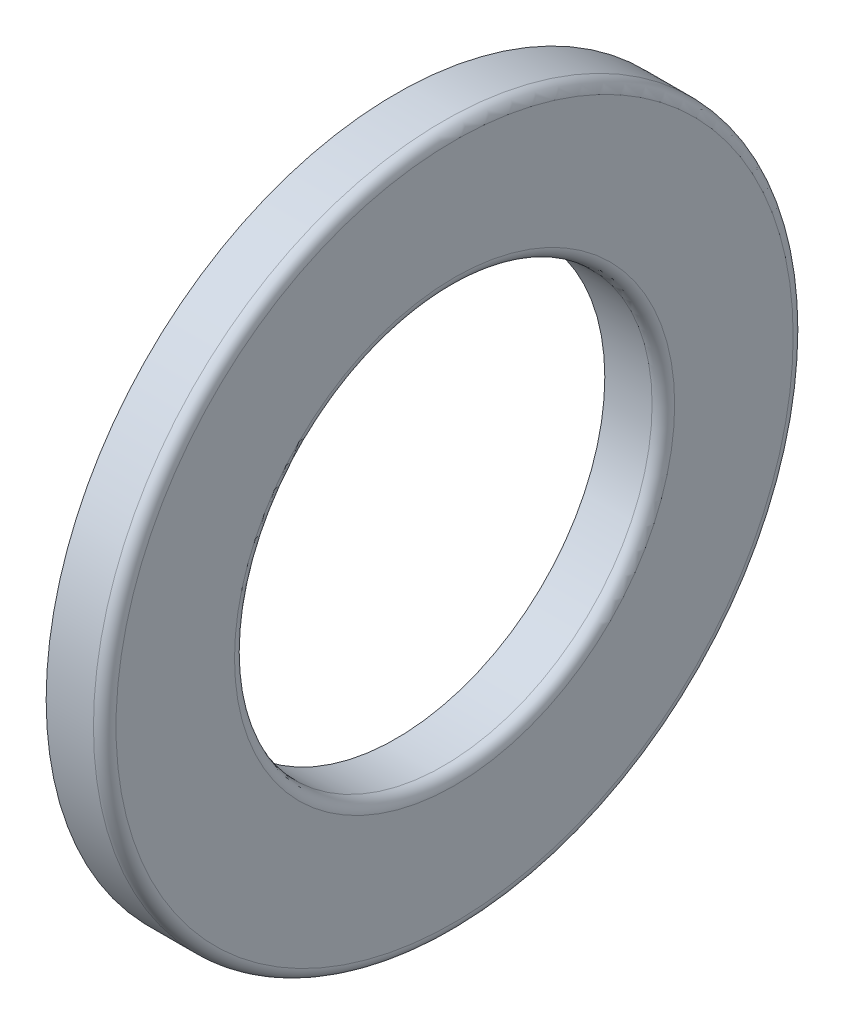
ISO-10303-21;
HEADER;
FILE_DESCRIPTION(('STEP AP214'),'2;1');
FILE_NAME('part.step','',(''),(''),'','','');
FILE_SCHEMA(('AUTOMOTIVE_DESIGN { 1 0 10303 214 1 1 1 1 }'));
ENDSEC;
DATA;
#1=APPLICATION_CONTEXT('core data for automotive mechanical design processes');
#2=APPLICATION_PROTOCOL_DEFINITION('international standard','automotive_design',2000,#1);
#3=PRODUCT_CONTEXT('',#1,'mechanical');
#4=PRODUCT('Part','Part','',(#3));
#5=PRODUCT_RELATED_PRODUCT_CATEGORY('part','',(#4));
#6=PRODUCT_DEFINITION_FORMATION('','',#4);
#7=PRODUCT_DEFINITION_CONTEXT('part definition',#1,'design');
#8=PRODUCT_DEFINITION('design','',#6,#7);
#9=PRODUCT_DEFINITION_SHAPE('','',#8);
#10=(LENGTH_UNIT() NAMED_UNIT(*) SI_UNIT(.MILLI.,.METRE.));
#11=(NAMED_UNIT(*) PLANE_ANGLE_UNIT() SI_UNIT($,.RADIAN.));
#12=(NAMED_UNIT(*) SI_UNIT($,.STERADIAN.) SOLID_ANGLE_UNIT());
#13=UNCERTAINTY_MEASURE_WITH_UNIT(LENGTH_MEASURE(1.E-05),#10,'distance_accuracy_value','');
#14=(GEOMETRIC_REPRESENTATION_CONTEXT(3) GLOBAL_UNCERTAINTY_ASSIGNED_CONTEXT((#13)) GLOBAL_UNIT_ASSIGNED_CONTEXT((#10,
#11,#12)) REPRESENTATION_CONTEXT('',''));
#15=CARTESIAN_POINT('',(0.,0.,0.));
#16=DIRECTION('',(0.,0.,1.));
#17=DIRECTION('',(1.,0.,0.));
#18=AXIS2_PLACEMENT_3D('',#15,#16,#17);
#19=CARTESIAN_POINT('',(9.00000000000001,0.,0.));
#20=DIRECTION('',(1.,0.,0.));
#21=DIRECTION('',(0.,0.,-1.));
#22=AXIS2_PLACEMENT_3D('',#19,#20,#21);
#23=TOROIDAL_SURFACE('',#22,24.25,4.76249999999999);
#24=CARTESIAN_POINT('',(12.81,0.,0.));
#25=DIRECTION('',(1.,0.,0.));
#26=DIRECTION('',(0.,0.,-1.));
#27=AXIS2_PLACEMENT_3D('',#24,#25,#26);
#28=CIRCLE('',#27,21.3925);
#29=CARTESIAN_POINT('',(12.81,0.,-21.3925));
#30=VERTEX_POINT('',#29);
#31=EDGE_CURVE('E87',#30,#30,#28,.F.);
#32=ORIENTED_EDGE('',*,*,#31,.F.);
#33=EDGE_LOOP('',(#32));
#34=FACE_BOUND('',#33,.T.);
#35=CARTESIAN_POINT('',(12.81,0.,0.));
#36=DIRECTION('',(1.,0.,0.));
#37=DIRECTION('',(0.,0.,-1.));
#38=AXIS2_PLACEMENT_3D('',#35,#36,#37);
#39=CIRCLE('',#38,27.1075);
#40=CARTESIAN_POINT('',(12.81,0.,-27.1075));
#41=VERTEX_POINT('',#40);
#42=EDGE_CURVE('E18',#41,#41,#39,.T.);
#43=ORIENTED_EDGE('',*,*,#42,.F.);
#44=EDGE_LOOP('',(#43));
#45=FACE_BOUND('',#44,.T.);
#46=ADVANCED_FACE('F14',(#34,#45),#23,.F.);
#47=CARTESIAN_POINT('',(12.81,31.,0.));
#48=DIRECTION('',(-1.,0.,0.));
#49=DIRECTION('',(0.,0.,1.));
#50=AXIS2_PLACEMENT_3D('',#47,#48,#49);
#51=PLANE('',#50);
#52=CARTESIAN_POINT('',(12.81,0.,0.));
#53=DIRECTION('',(-1.,0.,0.));
#54=DIRECTION('',(0.,0.,1.));
#55=AXIS2_PLACEMENT_3D('',#52,#53,#54);
#56=CIRCLE('',#55,31.);
#57=CARTESIAN_POINT('',(12.81,0.,31.));
#58=VERTEX_POINT('',#57);
#59=EDGE_CURVE('E85',#58,#58,#56,.F.);
#60=ORIENTED_EDGE('',*,*,#59,.F.);
#61=EDGE_LOOP('',(#60));
#62=FACE_BOUND('',#61,.T.);
#63=ORIENTED_EDGE('',*,*,#42,.T.);
#64=EDGE_LOOP('',(#63));
#65=FACE_BOUND('',#64,.T.);
#66=ADVANCED_FACE('F94',(#62,#65),#51,.T.);
#67=CARTESIAN_POINT('',(12.81,21.3925,0.));
#68=DIRECTION('',(-1.,0.,0.));
#69=DIRECTION('',(0.,0.,1.));
#70=AXIS2_PLACEMENT_3D('',#67,#68,#69);
#71=PLANE('',#70);
#72=ORIENTED_EDGE('',*,*,#31,.T.);
#73=EDGE_LOOP('',(#72));
#74=FACE_BOUND('',#73,.T.);
#75=CARTESIAN_POINT('',(12.81,0.,0.));
#76=DIRECTION('',(-1.,0.,0.));
#77=DIRECTION('',(0.,0.,1.));
#78=AXIS2_PLACEMENT_3D('',#75,#76,#77);
#79=CIRCLE('',#78,18.5);
#80=CARTESIAN_POINT('',(12.81,0.,18.5));
#81=VERTEX_POINT('',#80);
#82=EDGE_CURVE('E37',#81,#81,#79,.F.);
#83=ORIENTED_EDGE('',*,*,#82,.T.);
#84=EDGE_LOOP('',(#83));
#85=FACE_BOUND('',#84,.T.);
#86=ADVANCED_FACE('F102',(#74,#85),#71,.T.);
#87=CARTESIAN_POINT('',(17.,0.,0.));
#88=DIRECTION('',(-1.,0.,0.));
#89=DIRECTION('',(0.,0.,1.));
#90=AXIS2_PLACEMENT_3D('',#87,#88,#89);
#91=CYLINDRICAL_SURFACE('',#90,31.);
#92=CARTESIAN_POINT('',(17.,0.,0.));
#93=DIRECTION('',(1.,0.,0.));
#94=DIRECTION('',(0.,0.,-1.));
#95=AXIS2_PLACEMENT_3D('',#92,#93,#94);
#96=CIRCLE('',#95,31.);
#97=CARTESIAN_POINT('',(17.,0.,-31.));
#98=VERTEX_POINT('',#97);
#99=EDGE_CURVE('E32',#98,#98,#96,.T.);
#100=ORIENTED_EDGE('',*,*,#99,.F.);
#101=EDGE_LOOP('',(#100));
#102=FACE_BOUND('',#101,.T.);
#103=ORIENTED_EDGE('',*,*,#59,.T.);
#104=EDGE_LOOP('',(#103));
#105=FACE_BOUND('',#104,.T.);
#106=ADVANCED_FACE('F123',(#102,#105),#91,.T.);
#107=CARTESIAN_POINT('',(17.,0.,0.));
#108=DIRECTION('',(-1.,0.,0.));
#109=DIRECTION('',(0.,0.,1.));
#110=AXIS2_PLACEMENT_3D('',#107,#108,#109);
#111=CYLINDRICAL_SURFACE('',#110,18.5);
#112=ORIENTED_EDGE('',*,*,#82,.F.);
#113=EDGE_LOOP('',(#112));
#114=FACE_BOUND('',#113,.T.);
#115=CARTESIAN_POINT('',(17.,0.,0.));
#116=DIRECTION('',(1.,0.,0.));
#117=DIRECTION('',(0.,0.,-1.));
#118=AXIS2_PLACEMENT_3D('',#115,#116,#117);
#119=CIRCLE('',#118,18.5);
#120=CARTESIAN_POINT('',(17.,0.,-18.5));
#121=VERTEX_POINT('',#120);
#122=EDGE_CURVE('E27',#121,#121,#119,.F.);
#123=ORIENTED_EDGE('',*,*,#122,.F.);
#124=EDGE_LOOP('',(#123));
#125=FACE_BOUND('',#124,.T.);
#126=ADVANCED_FACE('F68',(#114,#125),#111,.F.);
#127=CARTESIAN_POINT('',(17.,0.,0.));
#128=DIRECTION('',(1.,0.,0.));
#129=DIRECTION('',(0.,0.,-1.));
#130=AXIS2_PLACEMENT_3D('',#127,#128,#129);
#131=TOROIDAL_SURFACE('',#130,30.,1.);
#132=CARTESIAN_POINT('',(18.,0.,0.));
#133=DIRECTION('',(-1.,0.,0.));
#134=DIRECTION('',(0.,0.,-1.));
#135=AXIS2_PLACEMENT_3D('',#132,#133,#134);
#136=CIRCLE('',#135,30.);
#137=CARTESIAN_POINT('',(18.,0.,-30.));
#138=VERTEX_POINT('',#137);
#139=EDGE_CURVE('E22',#138,#138,#136,.F.);
#140=ORIENTED_EDGE('',*,*,#139,.F.);
#141=EDGE_LOOP('',(#140));
#142=FACE_BOUND('',#141,.T.);
#143=ORIENTED_EDGE('',*,*,#99,.T.);
#144=EDGE_LOOP('',(#143));
#145=FACE_BOUND('',#144,.T.);
#146=ADVANCED_FACE('F63',(#142,#145),#131,.T.);
#147=CARTESIAN_POINT('',(17.,0.,0.));
#148=DIRECTION('',(1.,0.,0.));
#149=DIRECTION('',(0.,0.,-1.));
#150=AXIS2_PLACEMENT_3D('',#147,#148,#149);
#151=TOROIDAL_SURFACE('',#150,19.5,1.00000000000001);
#152=ORIENTED_EDGE('',*,*,#122,.T.);
#153=EDGE_LOOP('',(#152));
#154=FACE_BOUND('',#153,.T.);
#155=CARTESIAN_POINT('',(18.,0.,0.));
#156=DIRECTION('',(1.,0.,0.));
#157=DIRECTION('',(0.,0.,-1.));
#158=AXIS2_PLACEMENT_3D('',#155,#156,#157);
#159=CIRCLE('',#158,19.5);
#160=CARTESIAN_POINT('',(18.,0.,-19.5));
#161=VERTEX_POINT('',#160);
#162=EDGE_CURVE('E10',#161,#161,#159,.F.);
#163=ORIENTED_EDGE('',*,*,#162,.F.);
#164=EDGE_LOOP('',(#163));
#165=FACE_BOUND('',#164,.T.);
#166=ADVANCED_FACE('F52',(#154,#165),#151,.T.);
#167=CARTESIAN_POINT('',(18.,19.5,0.));
#168=DIRECTION('',(1.,0.,0.));
#169=DIRECTION('',(0.,0.,-1.));
#170=AXIS2_PLACEMENT_3D('',#167,#168,#169);
#171=PLANE('',#170);
#172=ORIENTED_EDGE('',*,*,#162,.T.);
#173=EDGE_LOOP('',(#172));
#174=FACE_BOUND('',#173,.T.);
#175=ORIENTED_EDGE('',*,*,#139,.T.);
#176=EDGE_LOOP('',(#175));
#177=FACE_BOUND('',#176,.T.);
#178=ADVANCED_FACE('F62',(#174,#177),#171,.T.);
#179=CLOSED_SHELL('',(#46,#66,#86,#106,#126,#146,#166,#178));
#180=MANIFOLD_SOLID_BREP('B1',#179);
#181=ADVANCED_BREP_SHAPE_REPRESENTATION('',(#18,#180),#14);
#182=SHAPE_DEFINITION_REPRESENTATION(#9,#181);
ENDSEC;
END-ISO-10303-21;
